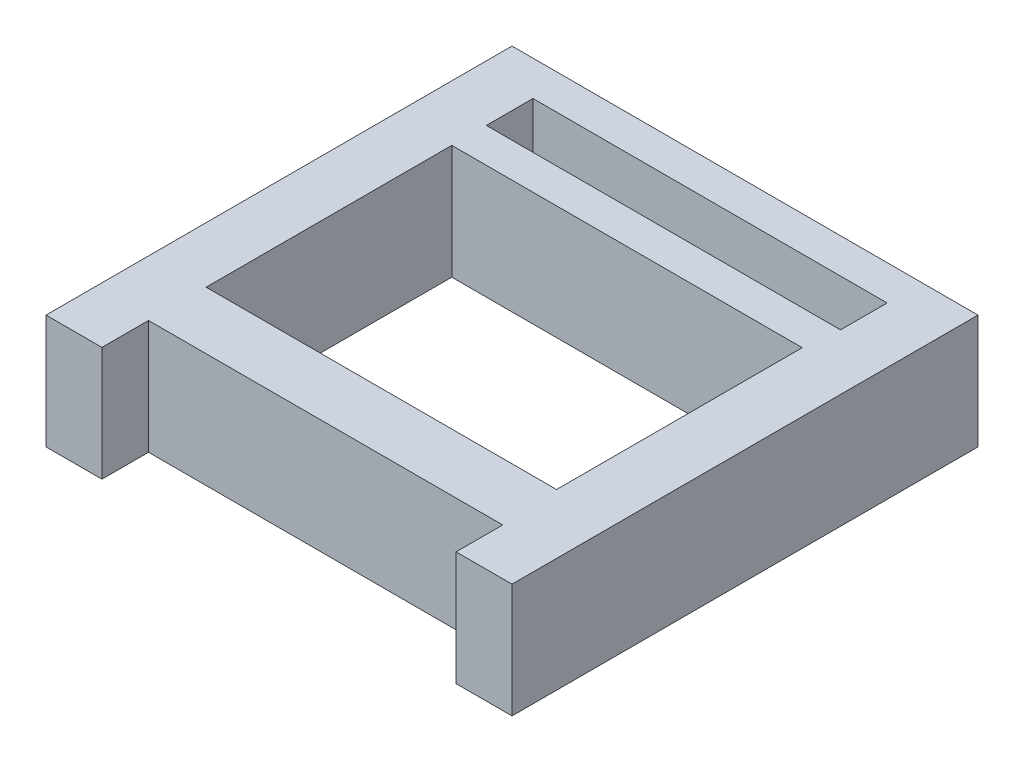
ISO-10303-21;
HEADER;
FILE_DESCRIPTION(('STEP AP214'),'2;1');
FILE_NAME('part.step','',(''),(''),'','','');
FILE_SCHEMA(('AUTOMOTIVE_DESIGN { 1 0 10303 214 1 1 1 1 }'));
ENDSEC;
DATA;
#1=APPLICATION_CONTEXT('core data for automotive mechanical design processes');
#2=APPLICATION_PROTOCOL_DEFINITION('international standard','automotive_design',2000,#1);
#3=PRODUCT_CONTEXT('',#1,'mechanical');
#4=PRODUCT('Part','Part','',(#3));
#5=PRODUCT_RELATED_PRODUCT_CATEGORY('part','',(#4));
#6=PRODUCT_DEFINITION_FORMATION('','',#4);
#7=PRODUCT_DEFINITION_CONTEXT('part definition',#1,'design');
#8=PRODUCT_DEFINITION('design','',#6,#7);
#9=PRODUCT_DEFINITION_SHAPE('','',#8);
#10=(LENGTH_UNIT() NAMED_UNIT(*) SI_UNIT(.MILLI.,.METRE.));
#11=(NAMED_UNIT(*) PLANE_ANGLE_UNIT() SI_UNIT($,.RADIAN.));
#12=(NAMED_UNIT(*) SI_UNIT($,.STERADIAN.) SOLID_ANGLE_UNIT());
#13=UNCERTAINTY_MEASURE_WITH_UNIT(LENGTH_MEASURE(1.E-05),#10,'distance_accuracy_value','');
#14=(GEOMETRIC_REPRESENTATION_CONTEXT(3) GLOBAL_UNCERTAINTY_ASSIGNED_CONTEXT((#13)) GLOBAL_UNIT_ASSIGNED_CONTEXT((#10,
#11,#12)) REPRESENTATION_CONTEXT('',''));
#15=CARTESIAN_POINT('',(0.,0.,0.));
#16=DIRECTION('',(0.,0.,1.));
#17=DIRECTION('',(1.,0.,0.));
#18=AXIS2_PLACEMENT_3D('',#15,#16,#17);
#19=CARTESIAN_POINT('',(0.,4.9,0.));
#20=DIRECTION('',(0.,1.,0.));
#21=DIRECTION('',(0.,0.,1.));
#22=AXIS2_PLACEMENT_3D('',#19,#20,#21);
#23=PLANE('',#22);
#24=DIRECTION('',(0.,0.,1.));
#25=VECTOR('',#24,1.);
#26=CARTESIAN_POINT('',(0.,4.9,0.));
#27=LINE('',#26,#25);
#28=CARTESIAN_POINT('',(0.,4.9,-18.));
#29=VERTEX_POINT('',#28);
#30=CARTESIAN_POINT('',(0.,4.9,2.));
#31=VERTEX_POINT('',#30);
#32=EDGE_CURVE('E250',#29,#31,#27,.T.);
#33=ORIENTED_EDGE('',*,*,#32,.T.);
#34=DIRECTION('',(1.,0.,0.));
#35=VECTOR('',#34,1.);
#36=CARTESIAN_POINT('',(0.,4.9,2.));
#37=LINE('',#36,#35);
#38=CARTESIAN_POINT('',(2.4,4.9,2.));
#39=VERTEX_POINT('',#38);
#40=EDGE_CURVE('E254',#31,#39,#37,.T.);
#41=ORIENTED_EDGE('',*,*,#40,.T.);
#42=DIRECTION('',(0.,0.,-1.));
#43=VECTOR('',#42,1.);
#44=CARTESIAN_POINT('',(2.4,4.9,0.));
#45=LINE('',#44,#43);
#46=CARTESIAN_POINT('',(2.4,4.9,0.));
#47=VERTEX_POINT('',#46);
#48=EDGE_CURVE('E258',#39,#47,#45,.T.);
#49=ORIENTED_EDGE('',*,*,#48,.T.);
#50=DIRECTION('',(1.,0.,0.));
#51=VECTOR('',#50,1.);
#52=CARTESIAN_POINT('',(2.4,4.9,0.));
#53=LINE('',#52,#51);
#54=CARTESIAN_POINT('',(17.6,4.9,0.));
#55=VERTEX_POINT('',#54);
#56=EDGE_CURVE('E261',#47,#55,#53,.T.);
#57=ORIENTED_EDGE('',*,*,#56,.T.);
#58=DIRECTION('',(0.,0.,1.));
#59=VECTOR('',#58,1.);
#60=CARTESIAN_POINT('',(17.6,4.9,0.));
#61=LINE('',#60,#59);
#62=CARTESIAN_POINT('',(17.6,4.9,2.));
#63=VERTEX_POINT('',#62);
#64=EDGE_CURVE('E264',#55,#63,#61,.T.);
#65=ORIENTED_EDGE('',*,*,#64,.T.);
#66=DIRECTION('',(1.,0.,0.));
#67=VECTOR('',#66,1.);
#68=CARTESIAN_POINT('',(20.,4.9,2.));
#69=LINE('',#68,#67);
#70=CARTESIAN_POINT('',(20.,4.9,2.));
#71=VERTEX_POINT('',#70);
#72=EDGE_CURVE('E267',#63,#71,#69,.T.);
#73=ORIENTED_EDGE('',*,*,#72,.T.);
#74=DIRECTION('',(0.,0.,-1.));
#75=VECTOR('',#74,1.);
#76=CARTESIAN_POINT('',(20.,4.9,0.));
#77=LINE('',#76,#75);
#78=CARTESIAN_POINT('',(20.,4.9,-18.));
#79=VERTEX_POINT('',#78);
#80=EDGE_CURVE('E270',#71,#79,#77,.T.);
#81=ORIENTED_EDGE('',*,*,#80,.T.);
#82=DIRECTION('',(-1.,0.,0.));
#83=VECTOR('',#82,1.);
#84=CARTESIAN_POINT('',(0.,4.9,-18.));
#85=LINE('',#84,#83);
#86=EDGE_CURVE('E273',#79,#29,#85,.T.);
#87=ORIENTED_EDGE('',*,*,#86,.T.);
#88=EDGE_LOOP('',(#33,#41,#49,#57,#65,#73,#81,#87));
#89=FACE_BOUND('',#88,.T.);
#90=DIRECTION('',(0.,0.,-1.));
#91=VECTOR('',#90,1.);
#92=CARTESIAN_POINT('',(17.4392045394057,4.9,-13.0160599029717));
#93=LINE('',#92,#91);
#94=CARTESIAN_POINT('',(17.4392045394058,4.9,-2.47303270831641));
#95=VERTEX_POINT('',#94);
#96=CARTESIAN_POINT('',(17.4392045394057,4.9,-13.0160599029717));
#97=VERTEX_POINT('',#96);
#98=EDGE_CURVE('E210',#95,#97,#93,.T.);
#99=ORIENTED_EDGE('',*,*,#98,.F.);
#100=DIRECTION('',(1.,0.,0.));
#101=VECTOR('',#100,1.);
#102=CARTESIAN_POINT('',(2.4,4.9,-2.47303270831641));
#103=LINE('',#102,#101);
#104=CARTESIAN_POINT('',(2.4,4.9,-2.47303270831641));
#105=VERTEX_POINT('',#104);
#106=EDGE_CURVE('E207',#105,#95,#103,.T.);
#107=ORIENTED_EDGE('',*,*,#106,.F.);
#108=DIRECTION('',(0.,0.,1.));
#109=VECTOR('',#108,1.);
#110=CARTESIAN_POINT('',(2.4,4.9,-13.0160599029717));
#111=LINE('',#110,#109);
#112=CARTESIAN_POINT('',(2.4,4.9,-13.0160599029717));
#113=VERTEX_POINT('',#112);
#114=EDGE_CURVE('E218',#113,#105,#111,.T.);
#115=ORIENTED_EDGE('',*,*,#114,.F.);
#116=DIRECTION('',(-1.,0.,0.));
#117=VECTOR('',#116,1.);
#118=CARTESIAN_POINT('',(2.4,4.9,-13.0160599029717));
#119=LINE('',#118,#117);
#120=EDGE_CURVE('E214',#97,#113,#119,.T.);
#121=ORIENTED_EDGE('',*,*,#120,.F.);
#122=EDGE_LOOP('',(#99,#107,#115,#121));
#123=FACE_BOUND('',#122,.T.);
#124=DIRECTION('',(1.,0.,0.));
#125=VECTOR('',#124,1.);
#126=CARTESIAN_POINT('',(2.4,4.9,-14.5));
#127=LINE('',#126,#125);
#128=CARTESIAN_POINT('',(2.4,4.9,-14.5));
#129=VERTEX_POINT('',#128);
#130=CARTESIAN_POINT('',(17.6,4.9,-14.5));
#131=VERTEX_POINT('',#130);
#132=EDGE_CURVE('E168',#129,#131,#127,.T.);
#133=ORIENTED_EDGE('',*,*,#132,.F.);
#134=DIRECTION('',(0.,0.,1.));
#135=VECTOR('',#134,1.);
#136=CARTESIAN_POINT('',(2.4,4.9,-16.5));
#137=LINE('',#136,#135);
#138=CARTESIAN_POINT('',(2.4,4.9,-16.5));
#139=VERTEX_POINT('',#138);
#140=EDGE_CURVE('E159',#139,#129,#137,.T.);
#141=ORIENTED_EDGE('',*,*,#140,.F.);
#142=DIRECTION('',(-1.,0.,0.));
#143=VECTOR('',#142,1.);
#144=CARTESIAN_POINT('',(2.4,4.9,-16.5));
#145=LINE('',#144,#143);
#146=CARTESIAN_POINT('',(17.6,4.9,-16.5));
#147=VERTEX_POINT('',#146);
#148=EDGE_CURVE('E185',#147,#139,#145,.T.);
#149=ORIENTED_EDGE('',*,*,#148,.F.);
#150=DIRECTION('',(0.,0.,-1.));
#151=VECTOR('',#150,1.);
#152=CARTESIAN_POINT('',(17.6,4.9,-16.5));
#153=LINE('',#152,#151);
#154=EDGE_CURVE('E181',#131,#147,#153,.T.);
#155=ORIENTED_EDGE('',*,*,#154,.F.);
#156=EDGE_LOOP('',(#133,#141,#149,#155));
#157=FACE_BOUND('',#156,.T.);
#158=ADVANCED_FACE('F45',(#89,#123,#157),#23,.T.);
#159=CARTESIAN_POINT('',(0.,0.,0.));
#160=DIRECTION('',(0.,1.,0.));
#161=DIRECTION('',(0.,0.,1.));
#162=AXIS2_PLACEMENT_3D('',#159,#160,#161);
#163=PLANE('',#162);
#164=DIRECTION('',(1.,0.,0.));
#165=VECTOR('',#164,1.);
#166=CARTESIAN_POINT('',(2.4,0.,-2.47303270831641));
#167=LINE('',#166,#165);
#168=CARTESIAN_POINT('',(2.4,0.,-2.47303270831641));
#169=VERTEX_POINT('',#168);
#170=CARTESIAN_POINT('',(17.4392045394058,0.,-2.47303270831641));
#171=VERTEX_POINT('',#170);
#172=EDGE_CURVE('E177',#169,#171,#167,.T.);
#173=ORIENTED_EDGE('',*,*,#172,.T.);
#174=DIRECTION('',(0.,0.,-1.));
#175=VECTOR('',#174,1.);
#176=CARTESIAN_POINT('',(17.4392045394057,0.,-13.0160599029717));
#177=LINE('',#176,#175);
#178=CARTESIAN_POINT('',(17.4392045394057,0.,-13.0160599029717));
#179=VERTEX_POINT('',#178);
#180=EDGE_CURVE('E225',#171,#179,#177,.T.);
#181=ORIENTED_EDGE('',*,*,#180,.T.);
#182=DIRECTION('',(-1.,0.,0.));
#183=VECTOR('',#182,1.);
#184=CARTESIAN_POINT('',(2.4,0.,-13.0160599029717));
#185=LINE('',#184,#183);
#186=CARTESIAN_POINT('',(2.4,0.,-13.0160599029717));
#187=VERTEX_POINT('',#186);
#188=EDGE_CURVE('E229',#179,#187,#185,.T.);
#189=ORIENTED_EDGE('',*,*,#188,.T.);
#190=DIRECTION('',(0.,0.,1.));
#191=VECTOR('',#190,1.);
#192=CARTESIAN_POINT('',(2.4,0.,-13.0160599029717));
#193=LINE('',#192,#191);
#194=EDGE_CURVE('E211',#187,#169,#193,.T.);
#195=ORIENTED_EDGE('',*,*,#194,.T.);
#196=EDGE_LOOP('',(#173,#181,#189,#195));
#197=FACE_BOUND('',#196,.T.);
#198=DIRECTION('',(1.,0.,0.));
#199=VECTOR('',#198,1.);
#200=CARTESIAN_POINT('',(0.,0.,2.));
#201=LINE('',#200,#199);
#202=CARTESIAN_POINT('',(0.,0.,2.));
#203=VERTEX_POINT('',#202);
#204=CARTESIAN_POINT('',(2.4,0.,2.));
#205=VERTEX_POINT('',#204);
#206=EDGE_CURVE('E249',#203,#205,#201,.T.);
#207=ORIENTED_EDGE('',*,*,#206,.F.);
#208=DIRECTION('',(0.,0.,1.));
#209=VECTOR('',#208,1.);
#210=CARTESIAN_POINT('',(0.,0.,0.));
#211=LINE('',#210,#209);
#212=CARTESIAN_POINT('',(0.,0.,-18.));
#213=VERTEX_POINT('',#212);
#214=EDGE_CURVE('E255',#213,#203,#211,.T.);
#215=ORIENTED_EDGE('',*,*,#214,.F.);
#216=DIRECTION('',(-1.,0.,0.));
#217=VECTOR('',#216,1.);
#218=CARTESIAN_POINT('',(0.,0.,-18.));
#219=LINE('',#218,#217);
#220=CARTESIAN_POINT('',(20.,0.,-18.));
#221=VERTEX_POINT('',#220);
#222=EDGE_CURVE('E296',#221,#213,#219,.T.);
#223=ORIENTED_EDGE('',*,*,#222,.F.);
#224=DIRECTION('',(0.,0.,-1.));
#225=VECTOR('',#224,1.);
#226=CARTESIAN_POINT('',(20.,0.,0.));
#227=LINE('',#226,#225);
#228=CARTESIAN_POINT('',(20.,0.,2.));
#229=VERTEX_POINT('',#228);
#230=EDGE_CURVE('E293',#229,#221,#227,.T.);
#231=ORIENTED_EDGE('',*,*,#230,.F.);
#232=DIRECTION('',(1.,0.,0.));
#233=VECTOR('',#232,1.);
#234=CARTESIAN_POINT('',(20.,0.,2.));
#235=LINE('',#234,#233);
#236=CARTESIAN_POINT('',(17.6,0.,2.));
#237=VERTEX_POINT('',#236);
#238=EDGE_CURVE('E289',#237,#229,#235,.T.);
#239=ORIENTED_EDGE('',*,*,#238,.F.);
#240=DIRECTION('',(0.,0.,1.));
#241=VECTOR('',#240,1.);
#242=CARTESIAN_POINT('',(17.6,0.,0.));
#243=LINE('',#242,#241);
#244=CARTESIAN_POINT('',(17.6,0.,0.));
#245=VERTEX_POINT('',#244);
#246=EDGE_CURVE('E286',#245,#237,#243,.T.);
#247=ORIENTED_EDGE('',*,*,#246,.F.);
#248=DIRECTION('',(1.,0.,0.));
#249=VECTOR('',#248,1.);
#250=CARTESIAN_POINT('',(2.4,0.,0.));
#251=LINE('',#250,#249);
#252=CARTESIAN_POINT('',(2.4,0.,0.));
#253=VERTEX_POINT('',#252);
#254=EDGE_CURVE('E283',#253,#245,#251,.T.);
#255=ORIENTED_EDGE('',*,*,#254,.F.);
#256=DIRECTION('',(0.,0.,-1.));
#257=VECTOR('',#256,1.);
#258=CARTESIAN_POINT('',(2.4,0.,0.));
#259=LINE('',#258,#257);
#260=EDGE_CURVE('E280',#205,#253,#259,.T.);
#261=ORIENTED_EDGE('',*,*,#260,.F.);
#262=EDGE_LOOP('',(#207,#215,#223,#231,#239,#247,#255,#261));
#263=FACE_BOUND('',#262,.T.);
#264=DIRECTION('',(0.,0.,1.));
#265=VECTOR('',#264,1.);
#266=CARTESIAN_POINT('',(2.4,0.,-16.5));
#267=LINE('',#266,#265);
#268=CARTESIAN_POINT('',(2.4,0.,-16.5));
#269=VERTEX_POINT('',#268);
#270=CARTESIAN_POINT('',(2.4,0.,-14.5));
#271=VERTEX_POINT('',#270);
#272=EDGE_CURVE('E69',#269,#271,#267,.T.);
#273=ORIENTED_EDGE('',*,*,#272,.T.);
#274=DIRECTION('',(1.,0.,0.));
#275=VECTOR('',#274,1.);
#276=CARTESIAN_POINT('',(2.4,0.,-14.5));
#277=LINE('',#276,#275);
#278=CARTESIAN_POINT('',(17.6,0.,-14.5));
#279=VERTEX_POINT('',#278);
#280=EDGE_CURVE('E175',#271,#279,#277,.T.);
#281=ORIENTED_EDGE('',*,*,#280,.T.);
#282=DIRECTION('',(0.,0.,-1.));
#283=VECTOR('',#282,1.);
#284=CARTESIAN_POINT('',(17.6,0.,-16.5));
#285=LINE('',#284,#283);
#286=CARTESIAN_POINT('',(17.6,0.,-16.5));
#287=VERTEX_POINT('',#286);
#288=EDGE_CURVE('E194',#279,#287,#285,.T.);
#289=ORIENTED_EDGE('',*,*,#288,.T.);
#290=DIRECTION('',(-1.,0.,0.));
#291=VECTOR('',#290,1.);
#292=CARTESIAN_POINT('',(2.4,0.,-16.5));
#293=LINE('',#292,#291);
#294=EDGE_CURVE('E169',#287,#269,#293,.T.);
#295=ORIENTED_EDGE('',*,*,#294,.T.);
#296=EDGE_LOOP('',(#273,#281,#289,#295));
#297=FACE_BOUND('',#296,.T.);
#298=ADVANCED_FACE('F335',(#197,#263,#297),#163,.F.);
#299=CARTESIAN_POINT('',(0.,4.9,2.));
#300=DIRECTION('',(0.,0.,-1.));
#301=DIRECTION('',(-1.,0.,0.));
#302=AXIS2_PLACEMENT_3D('',#299,#300,#301);
#303=PLANE('',#302);
#304=ORIENTED_EDGE('',*,*,#206,.T.);
#305=DIRECTION('',(0.,-1.,0.));
#306=VECTOR('',#305,1.);
#307=CARTESIAN_POINT('',(2.4,4.9,2.));
#308=LINE('',#307,#306);
#309=EDGE_CURVE('E54',#39,#205,#308,.T.);
#310=ORIENTED_EDGE('',*,*,#309,.F.);
#311=ORIENTED_EDGE('',*,*,#40,.F.);
#312=DIRECTION('',(0.,-1.,0.));
#313=VECTOR('',#312,1.);
#314=CARTESIAN_POINT('',(0.,4.9,2.));
#315=LINE('',#314,#313);
#316=EDGE_CURVE('E11',#31,#203,#315,.T.);
#317=ORIENTED_EDGE('',*,*,#316,.T.);
#318=EDGE_LOOP('',(#304,#310,#311,#317));
#319=FACE_BOUND('',#318,.T.);
#320=ADVANCED_FACE('F47',(#319),#303,.F.);
#321=CARTESIAN_POINT('',(2.4,4.9,0.));
#322=DIRECTION('',(-1.,0.,0.));
#323=DIRECTION('',(0.,0.,1.));
#324=AXIS2_PLACEMENT_3D('',#321,#322,#323);
#325=PLANE('',#324);
#326=ORIENTED_EDGE('',*,*,#260,.T.);
#327=DIRECTION('',(0.,-1.,0.));
#328=VECTOR('',#327,1.);
#329=CARTESIAN_POINT('',(2.4,4.9,0.));
#330=LINE('',#329,#328);
#331=EDGE_CURVE('E320',#47,#253,#330,.T.);
#332=ORIENTED_EDGE('',*,*,#331,.F.);
#333=ORIENTED_EDGE('',*,*,#48,.F.);
#334=ORIENTED_EDGE('',*,*,#309,.T.);
#335=EDGE_LOOP('',(#326,#332,#333,#334));
#336=FACE_BOUND('',#335,.T.);
#337=ADVANCED_FACE('F329',(#336),#325,.F.);
#338=CARTESIAN_POINT('',(2.4,4.9,0.));
#339=DIRECTION('',(0.,0.,-1.));
#340=DIRECTION('',(-1.,0.,0.));
#341=AXIS2_PLACEMENT_3D('',#338,#339,#340);
#342=PLANE('',#341);
#343=ORIENTED_EDGE('',*,*,#254,.T.);
#344=DIRECTION('',(0.,-1.,0.));
#345=VECTOR('',#344,1.);
#346=CARTESIAN_POINT('',(17.6,4.9,0.));
#347=LINE('',#346,#345);
#348=EDGE_CURVE('E316',#55,#245,#347,.T.);
#349=ORIENTED_EDGE('',*,*,#348,.F.);
#350=ORIENTED_EDGE('',*,*,#56,.F.);
#351=ORIENTED_EDGE('',*,*,#331,.T.);
#352=EDGE_LOOP('',(#343,#349,#350,#351));
#353=FACE_BOUND('',#352,.T.);
#354=ADVANCED_FACE('F342',(#353),#342,.F.);
#355=CARTESIAN_POINT('',(17.6,4.9,0.));
#356=DIRECTION('',(1.,0.,0.));
#357=DIRECTION('',(0.,0.,-1.));
#358=AXIS2_PLACEMENT_3D('',#355,#356,#357);
#359=PLANE('',#358);
#360=ORIENTED_EDGE('',*,*,#246,.T.);
#361=DIRECTION('',(0.,-1.,0.));
#362=VECTOR('',#361,1.);
#363=CARTESIAN_POINT('',(17.6,4.9,2.));
#364=LINE('',#363,#362);
#365=EDGE_CURVE('E312',#63,#237,#364,.T.);
#366=ORIENTED_EDGE('',*,*,#365,.F.);
#367=ORIENTED_EDGE('',*,*,#64,.F.);
#368=ORIENTED_EDGE('',*,*,#348,.T.);
#369=EDGE_LOOP('',(#360,#366,#367,#368));
#370=FACE_BOUND('',#369,.T.);
#371=ADVANCED_FACE('F346',(#370),#359,.F.);
#372=CARTESIAN_POINT('',(20.,4.9,2.));
#373=DIRECTION('',(0.,0.,-1.));
#374=DIRECTION('',(-1.,0.,0.));
#375=AXIS2_PLACEMENT_3D('',#372,#373,#374);
#376=PLANE('',#375);
#377=ORIENTED_EDGE('',*,*,#238,.T.);
#378=DIRECTION('',(0.,-1.,0.));
#379=VECTOR('',#378,1.);
#380=CARTESIAN_POINT('',(20.,4.9,2.));
#381=LINE('',#380,#379);
#382=EDGE_CURVE('E308',#71,#229,#381,.T.);
#383=ORIENTED_EDGE('',*,*,#382,.F.);
#384=ORIENTED_EDGE('',*,*,#72,.F.);
#385=ORIENTED_EDGE('',*,*,#365,.T.);
#386=EDGE_LOOP('',(#377,#383,#384,#385));
#387=FACE_BOUND('',#386,.T.);
#388=ADVANCED_FACE('F365',(#387),#376,.F.);
#389=CARTESIAN_POINT('',(20.,4.9,0.));
#390=DIRECTION('',(-1.,0.,0.));
#391=DIRECTION('',(0.,0.,1.));
#392=AXIS2_PLACEMENT_3D('',#389,#390,#391);
#393=PLANE('',#392);
#394=ORIENTED_EDGE('',*,*,#230,.T.);
#395=DIRECTION('',(0.,-1.,0.));
#396=VECTOR('',#395,1.);
#397=CARTESIAN_POINT('',(20.,4.9,-18.));
#398=LINE('',#397,#396);
#399=EDGE_CURVE('E304',#79,#221,#398,.T.);
#400=ORIENTED_EDGE('',*,*,#399,.F.);
#401=ORIENTED_EDGE('',*,*,#80,.F.);
#402=ORIENTED_EDGE('',*,*,#382,.T.);
#403=EDGE_LOOP('',(#394,#400,#401,#402));
#404=FACE_BOUND('',#403,.T.);
#405=ADVANCED_FACE('F363',(#404),#393,.F.);
#406=CARTESIAN_POINT('',(0.,4.9,-18.));
#407=DIRECTION('',(0.,0.,1.));
#408=DIRECTION('',(1.,0.,0.));
#409=AXIS2_PLACEMENT_3D('',#406,#407,#408);
#410=PLANE('',#409);
#411=ORIENTED_EDGE('',*,*,#222,.T.);
#412=DIRECTION('',(0.,-1.,0.));
#413=VECTOR('',#412,1.);
#414=CARTESIAN_POINT('',(0.,4.9,-18.));
#415=LINE('',#414,#413);
#416=EDGE_CURVE('E277',#29,#213,#415,.T.);
#417=ORIENTED_EDGE('',*,*,#416,.F.);
#418=ORIENTED_EDGE('',*,*,#86,.F.);
#419=ORIENTED_EDGE('',*,*,#399,.T.);
#420=EDGE_LOOP('',(#411,#417,#418,#419));
#421=FACE_BOUND('',#420,.T.);
#422=ADVANCED_FACE('F358',(#421),#410,.F.);
#423=CARTESIAN_POINT('',(0.,4.9,0.));
#424=DIRECTION('',(1.,0.,0.));
#425=DIRECTION('',(0.,0.,-1.));
#426=AXIS2_PLACEMENT_3D('',#423,#424,#425);
#427=PLANE('',#426);
#428=ORIENTED_EDGE('',*,*,#214,.T.);
#429=ORIENTED_EDGE('',*,*,#316,.F.);
#430=ORIENTED_EDGE('',*,*,#32,.F.);
#431=ORIENTED_EDGE('',*,*,#416,.T.);
#432=EDGE_LOOP('',(#428,#429,#430,#431));
#433=FACE_BOUND('',#432,.T.);
#434=ADVANCED_FACE('F354',(#433),#427,.F.);
#435=CARTESIAN_POINT('',(2.4,4.9,-2.47303270831641));
#436=DIRECTION('',(0.,0.,-1.));
#437=DIRECTION('',(-1.,0.,0.));
#438=AXIS2_PLACEMENT_3D('',#435,#436,#437);
#439=PLANE('',#438);
#440=ORIENTED_EDGE('',*,*,#172,.F.);
#441=DIRECTION('',(0.,-1.,0.));
#442=VECTOR('',#441,1.);
#443=CARTESIAN_POINT('',(2.4,4.9,-2.47303270831641));
#444=LINE('',#443,#442);
#445=EDGE_CURVE('E221',#105,#169,#444,.T.);
#446=ORIENTED_EDGE('',*,*,#445,.F.);
#447=ORIENTED_EDGE('',*,*,#106,.T.);
#448=DIRECTION('',(0.,-1.,0.));
#449=VECTOR('',#448,1.);
#450=CARTESIAN_POINT('',(17.4392045394058,4.9,-2.47303270831641));
#451=LINE('',#450,#449);
#452=EDGE_CURVE('E245',#95,#171,#451,.T.);
#453=ORIENTED_EDGE('',*,*,#452,.T.);
#454=EDGE_LOOP('',(#440,#446,#447,#453));
#455=FACE_BOUND('',#454,.T.);
#456=ADVANCED_FACE('F382',(#455),#439,.T.);
#457=CARTESIAN_POINT('',(17.4392045394057,4.9,-13.0160599029717));
#458=DIRECTION('',(-1.,0.,0.));
#459=DIRECTION('',(0.,0.,1.));
#460=AXIS2_PLACEMENT_3D('',#457,#458,#459);
#461=PLANE('',#460);
#462=ORIENTED_EDGE('',*,*,#180,.F.);
#463=ORIENTED_EDGE('',*,*,#452,.F.);
#464=ORIENTED_EDGE('',*,*,#98,.T.);
#465=DIRECTION('',(0.,-1.,0.));
#466=VECTOR('',#465,1.);
#467=CARTESIAN_POINT('',(17.4392045394057,4.9,-13.0160599029717));
#468=LINE('',#467,#466);
#469=EDGE_CURVE('E242',#97,#179,#468,.T.);
#470=ORIENTED_EDGE('',*,*,#469,.T.);
#471=EDGE_LOOP('',(#462,#463,#464,#470));
#472=FACE_BOUND('',#471,.T.);
#473=ADVANCED_FACE('F404',(#472),#461,.T.);
#474=CARTESIAN_POINT('',(2.4,4.9,-13.0160599029717));
#475=DIRECTION('',(0.,0.,1.));
#476=DIRECTION('',(1.,0.,0.));
#477=AXIS2_PLACEMENT_3D('',#474,#475,#476);
#478=PLANE('',#477);
#479=ORIENTED_EDGE('',*,*,#188,.F.);
#480=ORIENTED_EDGE('',*,*,#469,.F.);
#481=ORIENTED_EDGE('',*,*,#120,.T.);
#482=DIRECTION('',(0.,-1.,0.));
#483=VECTOR('',#482,1.);
#484=CARTESIAN_POINT('',(2.4,4.9,-13.0160599029717));
#485=LINE('',#484,#483);
#486=EDGE_CURVE('E239',#113,#187,#485,.T.);
#487=ORIENTED_EDGE('',*,*,#486,.T.);
#488=EDGE_LOOP('',(#479,#480,#481,#487));
#489=FACE_BOUND('',#488,.T.);
#490=ADVANCED_FACE('F412',(#489),#478,.T.);
#491=CARTESIAN_POINT('',(2.4,4.9,-13.0160599029717));
#492=DIRECTION('',(1.,0.,0.));
#493=DIRECTION('',(0.,0.,-1.));
#494=AXIS2_PLACEMENT_3D('',#491,#492,#493);
#495=PLANE('',#494);
#496=ORIENTED_EDGE('',*,*,#194,.F.);
#497=ORIENTED_EDGE('',*,*,#486,.F.);
#498=ORIENTED_EDGE('',*,*,#114,.T.);
#499=ORIENTED_EDGE('',*,*,#445,.T.);
#500=EDGE_LOOP('',(#496,#497,#498,#499));
#501=FACE_BOUND('',#500,.T.);
#502=ADVANCED_FACE('F420',(#501),#495,.T.);
#503=CARTESIAN_POINT('',(2.4,4.9,-16.5));
#504=DIRECTION('',(1.,0.,0.));
#505=DIRECTION('',(0.,0.,-1.));
#506=AXIS2_PLACEMENT_3D('',#503,#504,#505);
#507=PLANE('',#506);
#508=ORIENTED_EDGE('',*,*,#272,.F.);
#509=DIRECTION('',(0.,-1.,0.));
#510=VECTOR('',#509,1.);
#511=CARTESIAN_POINT('',(2.4,4.9,-16.5));
#512=LINE('',#511,#510);
#513=EDGE_CURVE('E163',#139,#269,#512,.T.);
#514=ORIENTED_EDGE('',*,*,#513,.F.);
#515=ORIENTED_EDGE('',*,*,#140,.T.);
#516=DIRECTION('',(0.,-1.,0.));
#517=VECTOR('',#516,1.);
#518=CARTESIAN_POINT('',(2.4,4.9,-14.5));
#519=LINE('',#518,#517);
#520=EDGE_CURVE('E162',#129,#271,#519,.T.);
#521=ORIENTED_EDGE('',*,*,#520,.T.);
#522=EDGE_LOOP('',(#508,#514,#515,#521));
#523=FACE_BOUND('',#522,.T.);
#524=ADVANCED_FACE('F161',(#523),#507,.T.);
#525=CARTESIAN_POINT('',(2.4,4.9,-14.5));
#526=DIRECTION('',(0.,0.,-1.));
#527=DIRECTION('',(-1.,0.,0.));
#528=AXIS2_PLACEMENT_3D('',#525,#526,#527);
#529=PLANE('',#528);
#530=ORIENTED_EDGE('',*,*,#280,.F.);
#531=ORIENTED_EDGE('',*,*,#520,.F.);
#532=ORIENTED_EDGE('',*,*,#132,.T.);
#533=DIRECTION('',(0.,-1.,0.));
#534=VECTOR('',#533,1.);
#535=CARTESIAN_POINT('',(17.6,4.9,-14.5));
#536=LINE('',#535,#534);
#537=EDGE_CURVE('E178',#131,#279,#536,.T.);
#538=ORIENTED_EDGE('',*,*,#537,.T.);
#539=EDGE_LOOP('',(#530,#531,#532,#538));
#540=FACE_BOUND('',#539,.T.);
#541=ADVANCED_FACE('F172',(#540),#529,.T.);
#542=CARTESIAN_POINT('',(17.6,4.9,-16.5));
#543=DIRECTION('',(-1.,0.,0.));
#544=DIRECTION('',(0.,0.,1.));
#545=AXIS2_PLACEMENT_3D('',#542,#543,#544);
#546=PLANE('',#545);
#547=ORIENTED_EDGE('',*,*,#288,.F.);
#548=ORIENTED_EDGE('',*,*,#537,.F.);
#549=ORIENTED_EDGE('',*,*,#154,.T.);
#550=DIRECTION('',(0.,-1.,0.));
#551=VECTOR('',#550,1.);
#552=CARTESIAN_POINT('',(17.6,4.9,-16.5));
#553=LINE('',#552,#551);
#554=EDGE_CURVE('E61',#147,#287,#553,.T.);
#555=ORIENTED_EDGE('',*,*,#554,.T.);
#556=EDGE_LOOP('',(#547,#548,#549,#555));
#557=FACE_BOUND('',#556,.T.);
#558=ADVANCED_FACE('F444',(#557),#546,.T.);
#559=CARTESIAN_POINT('',(2.4,4.9,-16.5));
#560=DIRECTION('',(0.,0.,1.));
#561=DIRECTION('',(1.,0.,0.));
#562=AXIS2_PLACEMENT_3D('',#559,#560,#561);
#563=PLANE('',#562);
#564=ORIENTED_EDGE('',*,*,#294,.F.);
#565=ORIENTED_EDGE('',*,*,#554,.F.);
#566=ORIENTED_EDGE('',*,*,#148,.T.);
#567=ORIENTED_EDGE('',*,*,#513,.T.);
#568=EDGE_LOOP('',(#564,#565,#566,#567));
#569=FACE_BOUND('',#568,.T.);
#570=ADVANCED_FACE('F452',(#569),#563,.T.);
#571=CLOSED_SHELL('',(#158,#298,#320,#337,#354,#371,#388,#405,#422,#434,#456,#473,#490,#502,
#524,#541,#558,#570));
#572=MANIFOLD_SOLID_BREP('B2',#571);
#573=ADVANCED_BREP_SHAPE_REPRESENTATION('',(#18,#572),#14);
#574=SHAPE_DEFINITION_REPRESENTATION(#9,#573);
ENDSEC;
END-ISO-10303-21;
